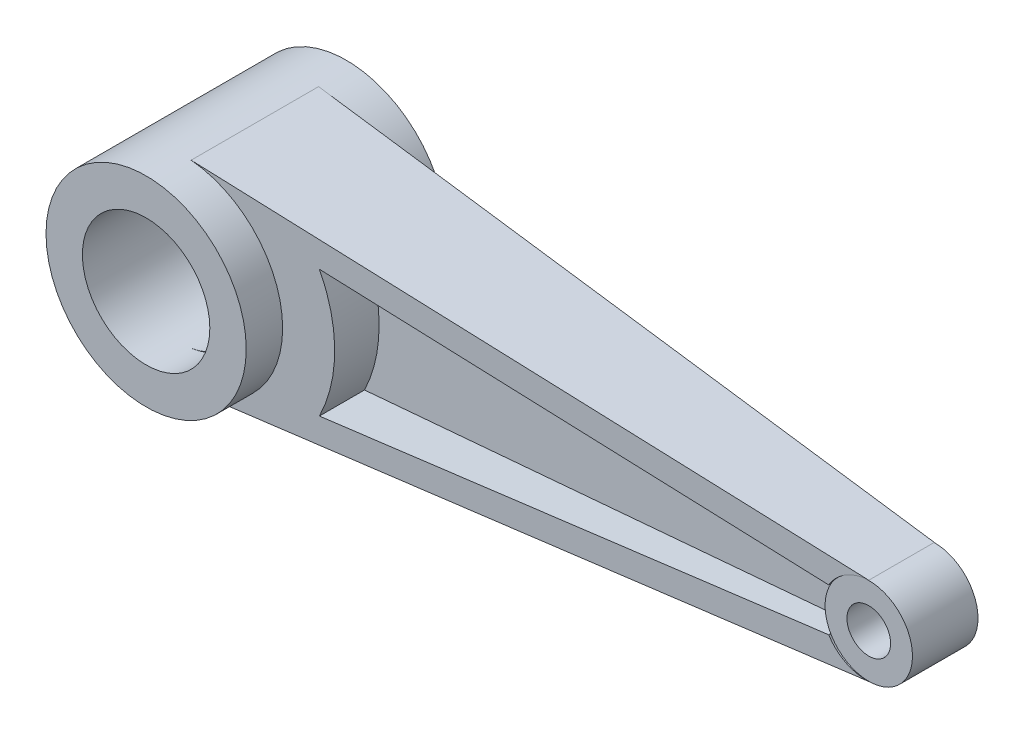
ISO-10303-21;
HEADER;
FILE_DESCRIPTION(('STEP AP214'),'2;1');
FILE_NAME('part.step','',(''),(''),'','','');
FILE_SCHEMA(('AUTOMOTIVE_DESIGN { 1 0 10303 214 1 1 1 1 }'));
ENDSEC;
DATA;
#1=APPLICATION_CONTEXT('core data for automotive mechanical design processes');
#2=APPLICATION_PROTOCOL_DEFINITION('international standard','automotive_design',2000,#1);
#3=PRODUCT_CONTEXT('',#1,'mechanical');
#4=PRODUCT('Part','Part','',(#3));
#5=PRODUCT_RELATED_PRODUCT_CATEGORY('part','',(#4));
#6=PRODUCT_DEFINITION_FORMATION('','',#4);
#7=PRODUCT_DEFINITION_CONTEXT('part definition',#1,'design');
#8=PRODUCT_DEFINITION('design','',#6,#7);
#9=PRODUCT_DEFINITION_SHAPE('','',#8);
#10=(LENGTH_UNIT() NAMED_UNIT(*) SI_UNIT(.MILLI.,.METRE.));
#11=(NAMED_UNIT(*) PLANE_ANGLE_UNIT() SI_UNIT($,.RADIAN.));
#12=(NAMED_UNIT(*) SI_UNIT($,.STERADIAN.) SOLID_ANGLE_UNIT());
#13=UNCERTAINTY_MEASURE_WITH_UNIT(LENGTH_MEASURE(1.E-05),#10,'distance_accuracy_value','');
#14=(GEOMETRIC_REPRESENTATION_CONTEXT(3) GLOBAL_UNCERTAINTY_ASSIGNED_CONTEXT((#13)) GLOBAL_UNIT_ASSIGNED_CONTEXT((#10,
#11,#12)) REPRESENTATION_CONTEXT('',''));
#15=CARTESIAN_POINT('',(0.,0.,0.));
#16=DIRECTION('',(0.,0.,1.));
#17=DIRECTION('',(1.,0.,0.));
#18=AXIS2_PLACEMENT_3D('',#15,#16,#17);
#19=CARTESIAN_POINT('',(180.,0.,9.));
#20=DIRECTION('',(0.,0.,1.));
#21=DIRECTION('',(1.,0.,0.));
#22=AXIS2_PLACEMENT_3D('',#19,#20,#21);
#23=PLANE('',#22);
#24=CARTESIAN_POINT('',(180.,0.,9.));
#25=DIRECTION('',(0.,0.,1.));
#26=DIRECTION('',(1.,0.,0.));
#27=AXIS2_PLACEMENT_3D('',#24,#25,#26);
#28=CIRCLE('',#27,6.00000000000002);
#29=CARTESIAN_POINT('',(186.,0.,9.));
#30=VERTEX_POINT('',#29);
#31=EDGE_CURVE('E64',#30,#30,#28,.T.);
#32=ORIENTED_EDGE('',*,*,#31,.F.);
#33=EDGE_LOOP('',(#32));
#34=FACE_BOUND('',#33,.T.);
#35=CARTESIAN_POINT('',(180.,0.,9.));
#36=DIRECTION('',(0.,0.,1.));
#37=DIRECTION('',(1.,0.,0.));
#38=AXIS2_PLACEMENT_3D('',#35,#36,#37);
#39=CIRCLE('',#38,12.);
#40=CARTESIAN_POINT('',(192.,0.,9.));
#41=VERTEX_POINT('',#40);
#42=EDGE_CURVE('E11',#41,#41,#39,.T.);
#43=ORIENTED_EDGE('',*,*,#42,.T.);
#44=EDGE_LOOP('',(#43));
#45=FACE_BOUND('',#44,.T.);
#46=ADVANCED_FACE('F53',(#34,#45),#23,.T.);
#47=CARTESIAN_POINT('',(180.,0.,-9.));
#48=DIRECTION('',(0.,0.,1.));
#49=DIRECTION('',(1.,0.,0.));
#50=AXIS2_PLACEMENT_3D('',#47,#48,#49);
#51=PLANE('',#50);
#52=CARTESIAN_POINT('',(180.,0.,-9.));
#53=DIRECTION('',(0.,0.,1.));
#54=DIRECTION('',(1.,0.,0.));
#55=AXIS2_PLACEMENT_3D('',#52,#53,#54);
#56=CIRCLE('',#55,6.00000000000002);
#57=CARTESIAN_POINT('',(186.,0.,-9.));
#58=VERTEX_POINT('',#57);
#59=EDGE_CURVE('E66',#58,#58,#56,.T.);
#60=ORIENTED_EDGE('',*,*,#59,.T.);
#61=EDGE_LOOP('',(#60));
#62=FACE_BOUND('',#61,.T.);
#63=CARTESIAN_POINT('',(180.,0.,-9.));
#64=DIRECTION('',(0.,0.,1.));
#65=DIRECTION('',(1.,0.,0.));
#66=AXIS2_PLACEMENT_3D('',#63,#64,#65);
#67=CIRCLE('',#66,12.);
#68=CARTESIAN_POINT('',(192.,0.,-9.));
#69=VERTEX_POINT('',#68);
#70=EDGE_CURVE('E57',#69,#69,#67,.T.);
#71=ORIENTED_EDGE('',*,*,#70,.F.);
#72=EDGE_LOOP('',(#71));
#73=FACE_BOUND('',#72,.T.);
#74=ADVANCED_FACE('F76',(#62,#73),#51,.F.);
#75=CARTESIAN_POINT('',(180.,0.,9.));
#76=DIRECTION('',(0.,0.,-1.));
#77=DIRECTION('',(-1.,0.,0.));
#78=AXIS2_PLACEMENT_3D('',#75,#76,#77);
#79=CYLINDRICAL_SURFACE('',#78,12.);
#80=ORIENTED_EDGE('',*,*,#42,.F.);
#81=EDGE_LOOP('',(#80));
#82=FACE_BOUND('',#81,.T.);
#83=ORIENTED_EDGE('',*,*,#70,.T.);
#84=EDGE_LOOP('',(#83));
#85=FACE_BOUND('',#84,.T.);
#86=ADVANCED_FACE('F55',(#82,#85),#79,.T.);
#87=CARTESIAN_POINT('',(180.,0.,9.));
#88=DIRECTION('',(0.,0.,-1.));
#89=DIRECTION('',(-1.,0.,0.));
#90=AXIS2_PLACEMENT_3D('',#87,#88,#89);
#91=CYLINDRICAL_SURFACE('',#90,6.00000000000002);
#92=ORIENTED_EDGE('',*,*,#31,.T.);
#93=EDGE_LOOP('',(#92));
#94=FACE_BOUND('',#93,.T.);
#95=ORIENTED_EDGE('',*,*,#59,.F.);
#96=EDGE_LOOP('',(#95));
#97=FACE_BOUND('',#96,.T.);
#98=ADVANCED_FACE('F72',(#94,#97),#91,.F.);
#99=CLOSED_SHELL('',(#46,#74,#86,#98));
#100=MANIFOLD_SOLID_BREP('B2',#99);
#101=CARTESIAN_POINT('',(0.,0.,27.5));
#102=DIRECTION('',(0.,0.,-1.));
#103=DIRECTION('',(-1.,0.,0.));
#104=AXIS2_PLACEMENT_3D('',#101,#102,#103);
#105=CYLINDRICAL_SURFACE('',#104,27.5);
#106=CARTESIAN_POINT('',(0.,0.,-27.5));
#107=DIRECTION('',(0.,0.,1.));
#108=DIRECTION('',(1.,0.,0.));
#109=AXIS2_PLACEMENT_3D('',#106,#107,#108);
#110=CIRCLE('',#109,27.5);
#111=CARTESIAN_POINT('',(27.5,0.,-27.5));
#112=VERTEX_POINT('',#111);
#113=EDGE_CURVE('E118',#112,#112,#110,.T.);
#114=ORIENTED_EDGE('',*,*,#113,.T.);
#115=EDGE_LOOP('',(#114));
#116=FACE_BOUND('',#115,.T.);
#117=CARTESIAN_POINT('',(0.,0.,27.5));
#118=DIRECTION('',(0.,0.,1.));
#119=DIRECTION('',(1.,0.,0.));
#120=AXIS2_PLACEMENT_3D('',#117,#118,#119);
#121=CIRCLE('',#120,27.5);
#122=CARTESIAN_POINT('',(27.5,0.,27.5));
#123=VERTEX_POINT('',#122);
#124=EDGE_CURVE('E51',#123,#123,#121,.T.);
#125=ORIENTED_EDGE('',*,*,#124,.F.);
#126=EDGE_LOOP('',(#125));
#127=FACE_BOUND('',#126,.T.);
#128=CARTESIAN_POINT('',(0.,0.,-17.5));
#129=DIRECTION('',(0.,0.,1.));
#130=DIRECTION('',(1.,0.,0.));
#131=AXIS2_PLACEMENT_3D('',#128,#129,#130);
#132=CIRCLE('',#131,27.5);
#133=CARTESIAN_POINT('',(2.36805555555555,27.3978523407548,-17.5));
#134=VERTEX_POINT('',#133);
#135=CARTESIAN_POINT('',(2.36805555555555,-27.3978523407548,-17.5));
#136=VERTEX_POINT('',#135);
#137=EDGE_CURVE('E311',#134,#136,#132,.F.);
#138=ORIENTED_EDGE('',*,*,#137,.T.);
#139=CARTESIAN_POINT('',(0.,0.,-17.6133156104617));
#140=DIRECTION('',(-0.047797062056878,0.,0.998857067281766));
#141=DIRECTION('',(-0.998857067281766,0.,-0.047797062056878));
#142=AXIS2_PLACEMENT_3D('',#139,#140,#141);
#143=ELLIPSE('',#142,27.5314666139741,27.5);
#144=CARTESIAN_POINT('',(4.68787981936025,-27.0974866509652,-17.3889923414169));
#145=VERTEX_POINT('',#144);
#146=EDGE_CURVE('E245',#136,#145,#143,.T.);
#147=ORIENTED_EDGE('',*,*,#146,.T.);
#148=DIRECTION('',(0.,0.,-1.));
#149=VECTOR('',#148,1.);
#150=CARTESIAN_POINT('',(4.68787981936025,-27.0974866509652,17.5));
#151=LINE('',#150,#149);
#152=CARTESIAN_POINT('',(4.68787981936025,-27.0974866509652,17.3889923414169));
#153=VERTEX_POINT('',#152);
#154=EDGE_CURVE('E243',#153,#145,#151,.T.);
#155=ORIENTED_EDGE('',*,*,#154,.F.);
#156=CARTESIAN_POINT('',(0.,0.,17.6133156104617));
#157=DIRECTION('',(0.047797062056878,0.,0.998857067281766));
#158=DIRECTION('',(0.998857067281766,0.,-0.047797062056878));
#159=AXIS2_PLACEMENT_3D('',#156,#157,#158);
#160=ELLIPSE('',#159,27.5314666139741,27.5);
#161=CARTESIAN_POINT('',(2.36805555555555,-27.3978523407548,17.5));
#162=VERTEX_POINT('',#161);
#163=EDGE_CURVE('E290',#162,#153,#160,.T.);
#164=ORIENTED_EDGE('',*,*,#163,.F.);
#165=CARTESIAN_POINT('',(0.,0.,17.5));
#166=DIRECTION('',(0.,0.,1.));
#167=DIRECTION('',(1.,0.,0.));
#168=AXIS2_PLACEMENT_3D('',#165,#166,#167);
#169=CIRCLE('',#168,27.5);
#170=CARTESIAN_POINT('',(2.36805555555555,27.3978523407548,17.5));
#171=VERTEX_POINT('',#170);
#172=EDGE_CURVE('E324',#171,#162,#169,.F.);
#173=ORIENTED_EDGE('',*,*,#172,.F.);
#174=DIRECTION('',(0.,0.,-1.));
#175=VECTOR('',#174,1.);
#176=CARTESIAN_POINT('',(2.36805555555555,27.3978523407548,17.5));
#177=LINE('',#176,#175);
#178=EDGE_CURVE('E327',#171,#134,#177,.T.);
#179=ORIENTED_EDGE('',*,*,#178,.T.);
#180=EDGE_LOOP('',(#138,#147,#155,#164,#173,#179));
#181=FACE_BOUND('',#180,.T.);
#182=ADVANCED_FACE('F115',(#116,#127,#181),#105,.T.);
#183=CARTESIAN_POINT('',(0.,0.,27.5));
#184=DIRECTION('',(0.,0.,-1.));
#185=DIRECTION('',(-1.,0.,0.));
#186=AXIS2_PLACEMENT_3D('',#183,#184,#185);
#187=CYLINDRICAL_SURFACE('',#186,17.5);
#188=CARTESIAN_POINT('',(0.,0.,-17.6133156104617));
#189=DIRECTION('',(-0.047797062056878,0.,0.998857067281766));
#190=DIRECTION('',(-0.998857067281766,0.,-0.047797062056878));
#191=AXIS2_PLACEMENT_3D('',#188,#189,#190);
#192=ELLIPSE('',#191,17.5200242088926,17.5);
#193=CARTESIAN_POINT('',(2.36805555555555,-17.3390401373837,-17.5));
#194=VERTEX_POINT('',#193);
#195=CARTESIAN_POINT('',(2.36805555555555,17.3390401373837,-17.5));
#196=VERTEX_POINT('',#195);
#197=EDGE_CURVE('E372',#194,#196,#192,.T.);
#198=ORIENTED_EDGE('',*,*,#197,.F.);
#199=CARTESIAN_POINT('',(0.,0.,-17.5));
#200=DIRECTION('',(0.,0.,-1.));
#201=DIRECTION('',(-1.,0.,0.));
#202=AXIS2_PLACEMENT_3D('',#199,#200,#201);
#203=CIRCLE('',#202,17.5);
#204=EDGE_CURVE('E284',#196,#194,#203,.T.);
#205=ORIENTED_EDGE('',*,*,#204,.F.);
#206=EDGE_LOOP('',(#198,#205));
#207=FACE_BOUND('',#206,.T.);
#208=CARTESIAN_POINT('',(0.,0.,27.5));
#209=DIRECTION('',(0.,0.,1.));
#210=DIRECTION('',(1.,0.,0.));
#211=AXIS2_PLACEMENT_3D('',#208,#209,#210);
#212=CIRCLE('',#211,17.5);
#213=CARTESIAN_POINT('',(17.5,0.,27.5));
#214=VERTEX_POINT('',#213);
#215=EDGE_CURVE('E262',#214,#214,#212,.T.);
#216=ORIENTED_EDGE('',*,*,#215,.T.);
#217=EDGE_LOOP('',(#216));
#218=FACE_BOUND('',#217,.T.);
#219=CARTESIAN_POINT('',(0.,0.,-27.5));
#220=DIRECTION('',(0.,0.,1.));
#221=DIRECTION('',(1.,0.,0.));
#222=AXIS2_PLACEMENT_3D('',#219,#220,#221);
#223=CIRCLE('',#222,17.5);
#224=CARTESIAN_POINT('',(17.5,0.,-27.5));
#225=VERTEX_POINT('',#224);
#226=EDGE_CURVE('E256',#225,#225,#223,.T.);
#227=ORIENTED_EDGE('',*,*,#226,.F.);
#228=EDGE_LOOP('',(#227));
#229=FACE_BOUND('',#228,.T.);
#230=CARTESIAN_POINT('',(0.,0.,17.5));
#231=DIRECTION('',(0.,0.,-1.));
#232=DIRECTION('',(-1.,0.,0.));
#233=AXIS2_PLACEMENT_3D('',#230,#231,#232);
#234=CIRCLE('',#233,17.5);
#235=CARTESIAN_POINT('',(2.36805555555555,17.3390401373837,17.5));
#236=VERTEX_POINT('',#235);
#237=CARTESIAN_POINT('',(2.36805555555555,-17.3390401373837,17.5));
#238=VERTEX_POINT('',#237);
#239=EDGE_CURVE('E279',#236,#238,#234,.T.);
#240=ORIENTED_EDGE('',*,*,#239,.T.);
#241=CARTESIAN_POINT('',(0.,0.,17.6133156104617));
#242=DIRECTION('',(0.047797062056878,0.,0.998857067281766));
#243=DIRECTION('',(0.998857067281766,0.,-0.047797062056878));
#244=AXIS2_PLACEMENT_3D('',#241,#242,#243);
#245=ELLIPSE('',#244,17.5200242088926,17.5);
#246=EDGE_CURVE('E280',#238,#236,#245,.T.);
#247=ORIENTED_EDGE('',*,*,#246,.T.);
#248=EDGE_LOOP('',(#240,#247));
#249=FACE_BOUND('',#248,.T.);
#250=ADVANCED_FACE('F272',(#207,#218,#229,#249),#187,.F.);
#251=CARTESIAN_POINT('',(2.34393990968017,-27.2987433254826,17.5));
#252=DIRECTION('',(-0.0855477909002128,0.996334068208095,0.));
#253=DIRECTION('',(-0.996334068208095,-0.0855477909002128,0.));
#254=AXIS2_PLACEMENT_3D('',#251,#252,#253);
#255=PLANE('',#254);
#256=ORIENTED_EDGE('',*,*,#154,.T.);
#257=DIRECTION('',(0.995203645028826,0.0854507298753471,0.0476222393961955));
#258=VECTOR('',#257,1.);
#259=CARTESIAN_POINT('',(4.00277851911884,-27.1563112005301,-17.4217756398842));
#260=LINE('',#259,#258);
#261=CARTESIAN_POINT('',(180.,-12.0447397079048,-9.));
#262=VERTEX_POINT('',#261);
#263=EDGE_CURVE('E225',#145,#262,#260,.T.);
#264=ORIENTED_EDGE('',*,*,#263,.T.);
#265=DIRECTION('',(0.,0.,-1.));
#266=VECTOR('',#265,1.);
#267=CARTESIAN_POINT('',(180.,-12.0447397079047,17.5));
#268=LINE('',#267,#266);
#269=CARTESIAN_POINT('',(180.,-12.0447397079047,9.));
#270=VERTEX_POINT('',#269);
#271=EDGE_CURVE('E241',#270,#262,#268,.T.);
#272=ORIENTED_EDGE('',*,*,#271,.F.);
#273=DIRECTION('',(0.995203645028826,0.0854507298753471,-0.0476222393961955));
#274=VECTOR('',#273,1.);
#275=CARTESIAN_POINT('',(2.34399460101532,-27.2987386295447,17.501151358863));
#276=LINE('',#275,#274);
#277=EDGE_CURVE('E393',#153,#270,#276,.T.);
#278=ORIENTED_EDGE('',*,*,#277,.F.);
#279=EDGE_LOOP('',(#256,#264,#272,#278));
#280=FACE_BOUND('',#279,.T.);
#281=ADVANCED_FACE('F239',(#280),#255,.F.);
#282=CARTESIAN_POINT('',(180.,0.,17.5));
#283=DIRECTION('',(0.,0.,-1.));
#284=DIRECTION('',(-1.,0.,0.));
#285=AXIS2_PLACEMENT_3D('',#282,#283,#284);
#286=CYLINDRICAL_SURFACE('',#285,12.0447397079047);
#287=CARTESIAN_POINT('',(180.,0.,-9.));
#288=DIRECTION('',(-0.047797062056878,0.,0.998857067281766));
#289=DIRECTION('',(-0.998857067281766,0.,-0.047797062056878));
#290=AXIS2_PLACEMENT_3D('',#287,#288,#289);
#291=ELLIPSE('',#290,12.0585217869886,12.0447397079047);
#292=CARTESIAN_POINT('',(169.513349956758,-5.92502535874293,-9.50180459177171));
#293=VERTEX_POINT('',#292);
#294=EDGE_CURVE('E221',#293,#262,#291,.T.);
#295=ORIENTED_EDGE('',*,*,#294,.F.);
#296=DIRECTION('',(0.,0.,-1.));
#297=VECTOR('',#296,1.);
#298=CARTESIAN_POINT('',(169.513349956758,-5.92502535874294,17.5));
#299=LINE('',#298,#297);
#300=CARTESIAN_POINT('',(169.513349956758,-5.92502535874294,-3.5));
#301=VERTEX_POINT('',#300);
#302=EDGE_CURVE('E258',#301,#293,#299,.T.);
#303=ORIENTED_EDGE('',*,*,#302,.F.);
#304=CARTESIAN_POINT('',(180.,0.,-3.5));
#305=DIRECTION('',(0.,0.,1.));
#306=DIRECTION('',(1.,0.,0.));
#307=AXIS2_PLACEMENT_3D('',#304,#305,#306);
#308=CIRCLE('',#307,12.0447397079047);
#309=CARTESIAN_POINT('',(169.513349956758,5.92502535874294,-3.5));
#310=VERTEX_POINT('',#309);
#311=EDGE_CURVE('E319',#310,#301,#308,.T.);
#312=ORIENTED_EDGE('',*,*,#311,.F.);
#313=DIRECTION('',(0.,0.,-1.));
#314=VECTOR('',#313,1.);
#315=CARTESIAN_POINT('',(169.513349956758,5.92502535874294,17.5));
#316=LINE('',#315,#314);
#317=CARTESIAN_POINT('',(169.513349956758,5.92502535874294,-9.5018045917717));
#318=VERTEX_POINT('',#317);
#319=EDGE_CURVE('E337',#310,#318,#316,.T.);
#320=ORIENTED_EDGE('',*,*,#319,.T.);
#321=CARTESIAN_POINT('',(180.,12.0447397079047,-9.));
#322=VERTEX_POINT('',#321);
#323=EDGE_CURVE('E235',#322,#318,#291,.T.);
#324=ORIENTED_EDGE('',*,*,#323,.F.);
#325=DIRECTION('',(0.,0.,-1.));
#326=VECTOR('',#325,1.);
#327=CARTESIAN_POINT('',(180.,12.0447397079047,17.5));
#328=LINE('',#327,#326);
#329=CARTESIAN_POINT('',(180.,12.0447397079047,9.));
#330=VERTEX_POINT('',#329);
#331=EDGE_CURVE('E333',#330,#322,#328,.T.);
#332=ORIENTED_EDGE('',*,*,#331,.F.);
#333=CARTESIAN_POINT('',(180.,0.,9.));
#334=DIRECTION('',(0.047797062056878,0.,0.998857067281766));
#335=DIRECTION('',(0.998857067281766,0.,-0.047797062056878));
#336=AXIS2_PLACEMENT_3D('',#333,#334,#335);
#337=ELLIPSE('',#336,12.0585217869886,12.0447397079047);
#338=CARTESIAN_POINT('',(169.513349956758,5.92502535874294,9.5018045917717));
#339=VERTEX_POINT('',#338);
#340=EDGE_CURVE('E379',#330,#339,#337,.T.);
#341=ORIENTED_EDGE('',*,*,#340,.T.);
#342=CARTESIAN_POINT('',(169.513349956758,5.92502535874294,3.5));
#343=VERTEX_POINT('',#342);
#344=EDGE_CURVE('E338',#339,#343,#316,.T.);
#345=ORIENTED_EDGE('',*,*,#344,.T.);
#346=CARTESIAN_POINT('',(180.,0.,3.5));
#347=DIRECTION('',(0.,0.,1.));
#348=DIRECTION('',(1.,0.,0.));
#349=AXIS2_PLACEMENT_3D('',#346,#347,#348);
#350=CIRCLE('',#349,12.0447397079047);
#351=CARTESIAN_POINT('',(169.513349956758,-5.92502535874294,3.5));
#352=VERTEX_POINT('',#351);
#353=EDGE_CURVE('E303',#343,#352,#350,.T.);
#354=ORIENTED_EDGE('',*,*,#353,.T.);
#355=CARTESIAN_POINT('',(169.513349956758,-5.92502535874293,9.5018045917717));
#356=VERTEX_POINT('',#355);
#357=EDGE_CURVE('E252',#356,#352,#299,.T.);
#358=ORIENTED_EDGE('',*,*,#357,.F.);
#359=EDGE_CURVE('E250',#356,#270,#337,.T.);
#360=ORIENTED_EDGE('',*,*,#359,.T.);
#361=ORIENTED_EDGE('',*,*,#271,.T.);
#362=EDGE_LOOP('',(#295,#303,#312,#320,#324,#332,#341,#345,#354,#358,#360,#361));
#363=FACE_BOUND('',#362,.T.);
#364=ADVANCED_FACE('F248',(#363),#286,.F.);
#365=CARTESIAN_POINT('',(1.76527777777778,-20.4238535631081,17.5));
#366=DIRECTION('',(-0.0861111111111111,0.996285539663811,0.));
#367=DIRECTION('',(-0.996285539663811,-0.0861111111111111,0.));
#368=AXIS2_PLACEMENT_3D('',#365,#366,#367);
#369=PLANE('',#368);
#370=DIRECTION('',(0.,0.,-1.));
#371=VECTOR('',#370,1.);
#372=CARTESIAN_POINT('',(35.9851843834635,-17.4661531222,17.5));
#373=LINE('',#372,#371);
#374=CARTESIAN_POINT('',(35.9851843834635,-17.4661531222,15.8913614415982));
#375=VERTEX_POINT('',#374);
#376=CARTESIAN_POINT('',(35.9851843834635,-17.4661531222,3.5));
#377=VERTEX_POINT('',#376);
#378=EDGE_CURVE('E345',#375,#377,#373,.T.);
#379=ORIENTED_EDGE('',*,*,#378,.F.);
#380=DIRECTION('',(0.995155281468098,0.0860134204539647,-0.0476199251150144));
#381=VECTOR('',#380,1.);
#382=CARTESIAN_POINT('',(1.76664467118652,-20.4237354195584,17.5287785653258));
#383=LINE('',#382,#381);
#384=EDGE_CURVE('E389',#375,#356,#383,.T.);
#385=ORIENTED_EDGE('',*,*,#384,.T.);
#386=ORIENTED_EDGE('',*,*,#357,.T.);
#387=DIRECTION('',(0.996285539663811,0.0861111111111111,0.));
#388=VECTOR('',#387,1.);
#389=CARTESIAN_POINT('',(1.76527777777778,-20.4238535631081,3.5));
#390=LINE('',#389,#388);
#391=EDGE_CURVE('E298',#377,#352,#390,.T.);
#392=ORIENTED_EDGE('',*,*,#391,.F.);
#393=EDGE_LOOP('',(#379,#385,#386,#392));
#394=FACE_BOUND('',#393,.T.);
#395=ADVANCED_FACE('F471',(#394),#369,.T.);
#396=CARTESIAN_POINT('',(0.,0.,17.5));
#397=DIRECTION('',(0.,0.,-1.));
#398=DIRECTION('',(-1.,0.,0.));
#399=AXIS2_PLACEMENT_3D('',#396,#397,#398);
#400=CYLINDRICAL_SURFACE('',#399,40.);
#401=DIRECTION('',(0.,0.,-1.));
#402=VECTOR('',#401,1.);
#403=CARTESIAN_POINT('',(35.9851843834635,17.4661531222,17.5));
#404=LINE('',#403,#402);
#405=CARTESIAN_POINT('',(35.9851843834635,17.4661531222,15.8913614415982));
#406=VERTEX_POINT('',#405);
#407=CARTESIAN_POINT('',(35.9851843834635,17.4661531222,3.5));
#408=VERTEX_POINT('',#407);
#409=EDGE_CURVE('E342',#406,#408,#404,.T.);
#410=ORIENTED_EDGE('',*,*,#409,.F.);
#411=CARTESIAN_POINT('',(0.,0.,17.6133156104617));
#412=DIRECTION('',(0.047797062056878,0.,0.998857067281766));
#413=DIRECTION('',(0.998857067281766,0.,-0.047797062056878));
#414=AXIS2_PLACEMENT_3D('',#411,#412,#413);
#415=ELLIPSE('',#414,40.0457696203259,40.);
#416=EDGE_CURVE('E386',#406,#375,#415,.F.);
#417=ORIENTED_EDGE('',*,*,#416,.T.);
#418=ORIENTED_EDGE('',*,*,#378,.T.);
#419=CARTESIAN_POINT('',(0.,0.,3.5));
#420=DIRECTION('',(0.,0.,1.));
#421=DIRECTION('',(1.,0.,0.));
#422=AXIS2_PLACEMENT_3D('',#419,#420,#421);
#423=CIRCLE('',#422,40.);
#424=EDGE_CURVE('E294',#408,#377,#423,.F.);
#425=ORIENTED_EDGE('',*,*,#424,.F.);
#426=EDGE_LOOP('',(#410,#417,#418,#425));
#427=FACE_BOUND('',#426,.T.);
#428=ADVANCED_FACE('F474',(#427),#400,.T.);
#429=CARTESIAN_POINT('',(1.76527777777777,20.4238535631081,17.5));
#430=DIRECTION('',(0.086111111111111,0.996285539663811,0.));
#431=DIRECTION('',(-0.996285539663811,0.086111111111111,0.));
#432=AXIS2_PLACEMENT_3D('',#429,#430,#431);
#433=PLANE('',#432);
#434=DIRECTION('',(0.995155281468098,-0.0860134204539646,-0.0476199251150144));
#435=VECTOR('',#434,1.);
#436=CARTESIAN_POINT('',(1.76664467118652,20.4237354195584,17.5287785653258));
#437=LINE('',#436,#435);
#438=EDGE_CURVE('E383',#406,#339,#437,.T.);
#439=ORIENTED_EDGE('',*,*,#438,.F.);
#440=ORIENTED_EDGE('',*,*,#409,.T.);
#441=DIRECTION('',(0.996285539663811,-0.086111111111111,0.));
#442=VECTOR('',#441,1.);
#443=CARTESIAN_POINT('',(1.76527777777777,20.4238535631081,3.5));
#444=LINE('',#443,#442);
#445=EDGE_CURVE('E307',#408,#343,#444,.T.);
#446=ORIENTED_EDGE('',*,*,#445,.T.);
#447=ORIENTED_EDGE('',*,*,#344,.F.);
#448=EDGE_LOOP('',(#439,#440,#446,#447));
#449=FACE_BOUND('',#448,.T.);
#450=ADVANCED_FACE('F465',(#449),#433,.F.);
#451=CARTESIAN_POINT('',(2.36805555555555,27.3978523407548,17.5));
#452=DIRECTION('',(0.0861111111111111,0.996285539663811,0.));
#453=DIRECTION('',(-0.996285539663811,0.0861111111111111,0.));
#454=AXIS2_PLACEMENT_3D('',#451,#452,#453);
#455=PLANE('',#454);
#456=DIRECTION('',(0.995155281468098,-0.0860134204539647,0.0476199251150144));
#457=VECTOR('',#456,1.);
#458=CARTESIAN_POINT('',(4.02667825490182,27.2544939983231,-17.4206319956214));
#459=LINE('',#458,#457);
#460=EDGE_CURVE('E409',#134,#322,#459,.T.);
#461=ORIENTED_EDGE('',*,*,#460,.F.);
#462=ORIENTED_EDGE('',*,*,#178,.F.);
#463=DIRECTION('',(0.995155281468098,-0.0860134204539647,-0.0476199251150144));
#464=VECTOR('',#463,1.);
#465=CARTESIAN_POINT('',(2.36805555555555,27.3978523407548,17.5));
#466=LINE('',#465,#464);
#467=EDGE_CURVE('E375',#171,#330,#466,.T.);
#468=ORIENTED_EDGE('',*,*,#467,.T.);
#469=ORIENTED_EDGE('',*,*,#331,.T.);
#470=EDGE_LOOP('',(#461,#462,#468,#469));
#471=FACE_BOUND('',#470,.T.);
#472=ADVANCED_FACE('F478',(#471),#455,.T.);
#473=DIRECTION('',(0.995155281468098,0.0860134204539647,0.0476199251150144));
#474=VECTOR('',#473,1.);
#475=CARTESIAN_POINT('',(3.42526737053279,-20.2803770771267,-17.4494105609472));
#476=LINE('',#475,#474);
#477=CARTESIAN_POINT('',(35.9851843834635,-17.4661531222,-15.8913614415982));
#478=VERTEX_POINT('',#477);
#479=EDGE_CURVE('E228',#478,#293,#476,.T.);
#480=ORIENTED_EDGE('',*,*,#479,.F.);
#481=CARTESIAN_POINT('',(35.9851843834635,-17.4661531222,-3.5));
#482=VERTEX_POINT('',#481);
#483=EDGE_CURVE('E344',#482,#478,#373,.T.);
#484=ORIENTED_EDGE('',*,*,#483,.F.);
#485=DIRECTION('',(0.996285539663811,0.0861111111111111,0.));
#486=VECTOR('',#485,1.);
#487=CARTESIAN_POINT('',(1.76527777777778,-20.4238535631081,-3.5));
#488=LINE('',#487,#486);
#489=EDGE_CURVE('E315',#482,#301,#488,.T.);
#490=ORIENTED_EDGE('',*,*,#489,.T.);
#491=ORIENTED_EDGE('',*,*,#302,.T.);
#492=EDGE_LOOP('',(#480,#484,#490,#491));
#493=FACE_BOUND('',#492,.T.);
#494=ADVANCED_FACE('F362',(#493),#369,.T.);
#495=CARTESIAN_POINT('',(0.,0.,-17.6133156104617));
#496=DIRECTION('',(-0.047797062056878,0.,0.998857067281766));
#497=DIRECTION('',(-0.998857067281766,0.,-0.047797062056878));
#498=AXIS2_PLACEMENT_3D('',#495,#496,#497);
#499=ELLIPSE('',#498,40.0457696203259,40.);
#500=CARTESIAN_POINT('',(35.9851843834635,17.4661531222,-15.8913614415982));
#501=VERTEX_POINT('',#500);
#502=EDGE_CURVE('E359',#501,#478,#499,.F.);
#503=ORIENTED_EDGE('',*,*,#502,.F.);
#504=CARTESIAN_POINT('',(35.9851843834635,17.4661531222,-3.5));
#505=VERTEX_POINT('',#504);
#506=EDGE_CURVE('E341',#505,#501,#404,.T.);
#507=ORIENTED_EDGE('',*,*,#506,.F.);
#508=CARTESIAN_POINT('',(0.,0.,-3.5));
#509=DIRECTION('',(0.,0.,1.));
#510=DIRECTION('',(1.,0.,0.));
#511=AXIS2_PLACEMENT_3D('',#508,#509,#510);
#512=CIRCLE('',#511,40.);
#513=EDGE_CURVE('E288',#505,#482,#512,.F.);
#514=ORIENTED_EDGE('',*,*,#513,.T.);
#515=ORIENTED_EDGE('',*,*,#483,.T.);
#516=EDGE_LOOP('',(#503,#507,#514,#515));
#517=FACE_BOUND('',#516,.T.);
#518=ADVANCED_FACE('F357',(#517),#400,.T.);
#519=ORIENTED_EDGE('',*,*,#506,.T.);
#520=DIRECTION('',(0.995155281468098,-0.0860134204539646,0.0476199251150144));
#521=VECTOR('',#520,1.);
#522=CARTESIAN_POINT('',(3.42526737053278,20.2803770771267,-17.4494105609472));
#523=LINE('',#522,#521);
#524=EDGE_CURVE('E366',#501,#318,#523,.T.);
#525=ORIENTED_EDGE('',*,*,#524,.T.);
#526=ORIENTED_EDGE('',*,*,#319,.F.);
#527=DIRECTION('',(0.996285539663811,-0.086111111111111,0.));
#528=VECTOR('',#527,1.);
#529=CARTESIAN_POINT('',(1.76527777777777,20.4238535631081,-3.5));
#530=LINE('',#529,#528);
#531=EDGE_CURVE('E299',#505,#310,#530,.T.);
#532=ORIENTED_EDGE('',*,*,#531,.F.);
#533=EDGE_LOOP('',(#519,#525,#526,#532));
#534=FACE_BOUND('',#533,.T.);
#535=ADVANCED_FACE('F423',(#534),#433,.F.);
#536=CARTESIAN_POINT('',(0.,0.,27.5));
#537=DIRECTION('',(0.,0.,1.));
#538=DIRECTION('',(1.,0.,0.));
#539=AXIS2_PLACEMENT_3D('',#536,#537,#538);
#540=PLANE('',#539);
#541=ORIENTED_EDGE('',*,*,#124,.T.);
#542=EDGE_LOOP('',(#541));
#543=FACE_BOUND('',#542,.T.);
#544=ORIENTED_EDGE('',*,*,#215,.F.);
#545=EDGE_LOOP('',(#544));
#546=FACE_BOUND('',#545,.T.);
#547=ADVANCED_FACE('F453',(#543,#546),#540,.T.);
#548=CARTESIAN_POINT('',(0.,0.,-27.5));
#549=DIRECTION('',(0.,0.,1.));
#550=DIRECTION('',(1.,0.,0.));
#551=AXIS2_PLACEMENT_3D('',#548,#549,#550);
#552=PLANE('',#551);
#553=ORIENTED_EDGE('',*,*,#113,.F.);
#554=EDGE_LOOP('',(#553));
#555=FACE_BOUND('',#554,.T.);
#556=ORIENTED_EDGE('',*,*,#226,.T.);
#557=EDGE_LOOP('',(#556));
#558=FACE_BOUND('',#557,.T.);
#559=ADVANCED_FACE('F270',(#555,#558),#552,.F.);
#560=CARTESIAN_POINT('',(0.,0.,3.5));
#561=DIRECTION('',(0.,0.,1.));
#562=DIRECTION('',(1.,0.,0.));
#563=AXIS2_PLACEMENT_3D('',#560,#561,#562);
#564=PLANE('',#563);
#565=ORIENTED_EDGE('',*,*,#424,.T.);
#566=ORIENTED_EDGE('',*,*,#391,.T.);
#567=ORIENTED_EDGE('',*,*,#353,.F.);
#568=ORIENTED_EDGE('',*,*,#445,.F.);
#569=EDGE_LOOP('',(#565,#566,#567,#568));
#570=FACE_BOUND('',#569,.T.);
#571=ADVANCED_FACE('F434',(#570),#564,.T.);
#572=CARTESIAN_POINT('',(0.,0.,-3.5));
#573=DIRECTION('',(0.,0.,1.));
#574=DIRECTION('',(1.,0.,0.));
#575=AXIS2_PLACEMENT_3D('',#572,#573,#574);
#576=PLANE('',#575);
#577=ORIENTED_EDGE('',*,*,#513,.F.);
#578=ORIENTED_EDGE('',*,*,#531,.T.);
#579=ORIENTED_EDGE('',*,*,#311,.T.);
#580=ORIENTED_EDGE('',*,*,#489,.F.);
#581=EDGE_LOOP('',(#577,#578,#579,#580));
#582=FACE_BOUND('',#581,.T.);
#583=ADVANCED_FACE('F431',(#582),#576,.F.);
#584=CARTESIAN_POINT('',(180.,-27.5,17.5));
#585=DIRECTION('',(0.,0.,-1.));
#586=DIRECTION('',(-1.,0.,0.));
#587=AXIS2_PLACEMENT_3D('',#584,#585,#586);
#588=PLANE('',#587);
#589=DIRECTION('',(0.,1.,0.));
#590=VECTOR('',#589,1.);
#591=CARTESIAN_POINT('',(2.36805555555555,-27.5,17.5));
#592=LINE('',#591,#590);
#593=EDGE_CURVE('E415',#236,#171,#592,.T.);
#594=ORIENTED_EDGE('',*,*,#593,.T.);
#595=ORIENTED_EDGE('',*,*,#172,.T.);
#596=EDGE_CURVE('E138',#162,#238,#592,.T.);
#597=ORIENTED_EDGE('',*,*,#596,.T.);
#598=ORIENTED_EDGE('',*,*,#239,.F.);
#599=EDGE_LOOP('',(#594,#595,#597,#598));
#600=FACE_BOUND('',#599,.T.);
#601=ADVANCED_FACE('F433',(#600),#588,.T.);
#602=CARTESIAN_POINT('',(2.36805555555555,-27.5,17.5));
#603=DIRECTION('',(0.047797062056878,0.,0.998857067281766));
#604=DIRECTION('',(0.998857067281766,0.,-0.047797062056878));
#605=AXIS2_PLACEMENT_3D('',#602,#603,#604);
#606=PLANE('',#605);
#607=ORIENTED_EDGE('',*,*,#596,.F.);
#608=ORIENTED_EDGE('',*,*,#163,.T.);
#609=ORIENTED_EDGE('',*,*,#277,.T.);
#610=ORIENTED_EDGE('',*,*,#359,.F.);
#611=ORIENTED_EDGE('',*,*,#384,.F.);
#612=ORIENTED_EDGE('',*,*,#416,.F.);
#613=ORIENTED_EDGE('',*,*,#438,.T.);
#614=ORIENTED_EDGE('',*,*,#340,.F.);
#615=ORIENTED_EDGE('',*,*,#467,.F.);
#616=ORIENTED_EDGE('',*,*,#593,.F.);
#617=ORIENTED_EDGE('',*,*,#246,.F.);
#618=EDGE_LOOP('',(#607,#608,#609,#610,#611,#612,#613,#614,#615,#616,#617));
#619=FACE_BOUND('',#618,.T.);
#620=ADVANCED_FACE('F398',(#619),#606,.T.);
#621=CARTESIAN_POINT('',(180.,-27.5,-17.5));
#622=DIRECTION('',(0.,0.,-1.));
#623=DIRECTION('',(-1.,0.,0.));
#624=AXIS2_PLACEMENT_3D('',#621,#622,#623);
#625=PLANE('',#624);
#626=ORIENTED_EDGE('',*,*,#204,.T.);
#627=DIRECTION('',(0.,1.,0.));
#628=VECTOR('',#627,1.);
#629=CARTESIAN_POINT('',(2.36805555555555,-27.5,-17.5));
#630=LINE('',#629,#628);
#631=EDGE_CURVE('E403',#136,#194,#630,.T.);
#632=ORIENTED_EDGE('',*,*,#631,.F.);
#633=ORIENTED_EDGE('',*,*,#137,.F.);
#634=EDGE_CURVE('E130',#196,#134,#630,.T.);
#635=ORIENTED_EDGE('',*,*,#634,.F.);
#636=EDGE_LOOP('',(#626,#632,#633,#635));
#637=FACE_BOUND('',#636,.T.);
#638=ADVANCED_FACE('F405',(#637),#625,.F.);
#639=CARTESIAN_POINT('',(2.36805555555555,-27.5,-17.5));
#640=DIRECTION('',(-0.047797062056878,0.,0.998857067281766));
#641=DIRECTION('',(0.998857067281766,0.,0.047797062056878));
#642=AXIS2_PLACEMENT_3D('',#639,#640,#641);
#643=PLANE('',#642);
#644=ORIENTED_EDGE('',*,*,#197,.T.);
#645=ORIENTED_EDGE('',*,*,#634,.T.);
#646=ORIENTED_EDGE('',*,*,#460,.T.);
#647=ORIENTED_EDGE('',*,*,#323,.T.);
#648=ORIENTED_EDGE('',*,*,#524,.F.);
#649=ORIENTED_EDGE('',*,*,#502,.T.);
#650=ORIENTED_EDGE('',*,*,#479,.T.);
#651=ORIENTED_EDGE('',*,*,#294,.T.);
#652=ORIENTED_EDGE('',*,*,#263,.F.);
#653=ORIENTED_EDGE('',*,*,#146,.F.);
#654=ORIENTED_EDGE('',*,*,#631,.T.);
#655=EDGE_LOOP('',(#644,#645,#646,#647,#648,#649,#650,#651,#652,#653,#654));
#656=FACE_BOUND('',#655,.T.);
#657=ADVANCED_FACE('F223',(#656),#643,.F.);
#658=CLOSED_SHELL('',(#182,#250,#281,#364,#395,#428,#450,#472,#494,#518,#535,#547,#559,#571,
#583,#601,#620,#638,#657));
#659=MANIFOLD_SOLID_BREP('B6',#658);
#660=ADVANCED_BREP_SHAPE_REPRESENTATION('',(#18,#100,#659),#14);
#661=SHAPE_DEFINITION_REPRESENTATION(#9,#660);
ENDSEC;
END-ISO-10303-21;
